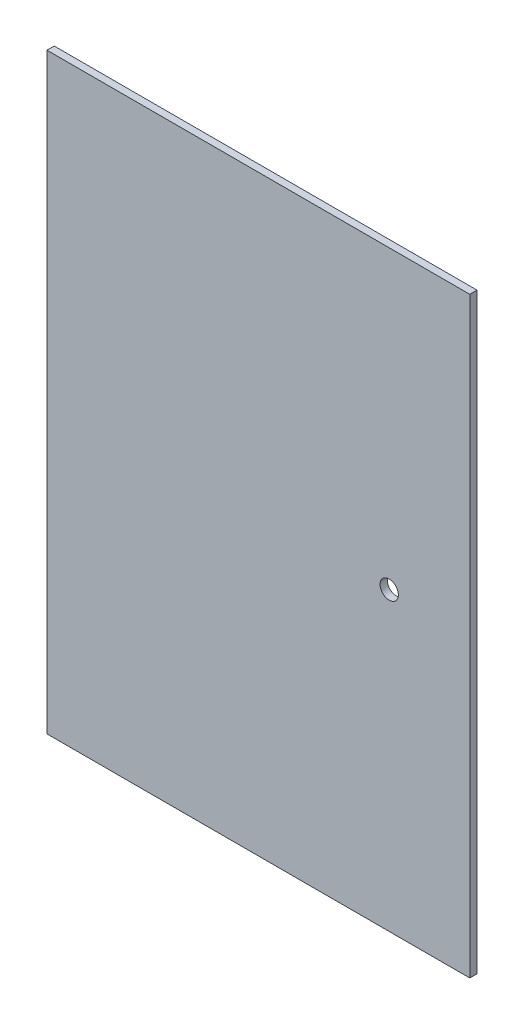
ISO-10303-21;
HEADER;
FILE_DESCRIPTION(('STEP AP214'),'2;1');
FILE_NAME('part.step','',(''),(''),'','','');
FILE_SCHEMA(('AUTOMOTIVE_DESIGN { 1 0 10303 214 1 1 1 1 }'));
ENDSEC;
DATA;
#1=APPLICATION_CONTEXT('core data for automotive mechanical design processes');
#2=APPLICATION_PROTOCOL_DEFINITION('international standard','automotive_design',2000,#1);
#3=PRODUCT_CONTEXT('',#1,'mechanical');
#4=PRODUCT('Part','Part','',(#3));
#5=PRODUCT_RELATED_PRODUCT_CATEGORY('part','',(#4));
#6=PRODUCT_DEFINITION_FORMATION('','',#4);
#7=PRODUCT_DEFINITION_CONTEXT('part definition',#1,'design');
#8=PRODUCT_DEFINITION('design','',#6,#7);
#9=PRODUCT_DEFINITION_SHAPE('','',#8);
#10=(LENGTH_UNIT() NAMED_UNIT(*) SI_UNIT(.MILLI.,.METRE.));
#11=(NAMED_UNIT(*) PLANE_ANGLE_UNIT() SI_UNIT($,.RADIAN.));
#12=(NAMED_UNIT(*) SI_UNIT($,.STERADIAN.) SOLID_ANGLE_UNIT());
#13=UNCERTAINTY_MEASURE_WITH_UNIT(LENGTH_MEASURE(1.E-05),#10,'distance_accuracy_value','');
#14=(GEOMETRIC_REPRESENTATION_CONTEXT(3) GLOBAL_UNCERTAINTY_ASSIGNED_CONTEXT((#13)) GLOBAL_UNIT_ASSIGNED_CONTEXT((#10,
#11,#12)) REPRESENTATION_CONTEXT('',''));
#15=CARTESIAN_POINT('',(0.,0.,0.));
#16=DIRECTION('',(0.,0.,1.));
#17=DIRECTION('',(1.,0.,0.));
#18=AXIS2_PLACEMENT_3D('',#15,#16,#17);
#19=CARTESIAN_POINT('',(-233.5,327.,0.));
#20=DIRECTION('',(-1.,0.,0.));
#21=DIRECTION('',(0.,0.,1.));
#22=AXIS2_PLACEMENT_3D('',#19,#20,#21);
#23=PLANE('',#22);
#24=DIRECTION('',(0.,-1.,0.));
#25=VECTOR('',#24,1.);
#26=CARTESIAN_POINT('',(-233.5,327.,8.));
#27=LINE('',#26,#25);
#28=CARTESIAN_POINT('',(-233.5,327.,8.));
#29=VERTEX_POINT('',#28);
#30=CARTESIAN_POINT('',(-233.5,-327.,8.));
#31=VERTEX_POINT('',#30);
#32=EDGE_CURVE('E100',#29,#31,#27,.T.);
#33=ORIENTED_EDGE('',*,*,#32,.F.);
#34=DIRECTION('',(0.,0.,1.));
#35=VECTOR('',#34,1.);
#36=CARTESIAN_POINT('',(-233.5,327.,0.));
#37=LINE('',#36,#35);
#38=CARTESIAN_POINT('',(-233.5,327.,0.));
#39=VERTEX_POINT('',#38);
#40=EDGE_CURVE('E11',#39,#29,#37,.T.);
#41=ORIENTED_EDGE('',*,*,#40,.F.);
#42=DIRECTION('',(0.,-1.,0.));
#43=VECTOR('',#42,1.);
#44=CARTESIAN_POINT('',(-233.5,327.,0.));
#45=LINE('',#44,#43);
#46=CARTESIAN_POINT('',(-233.5,-327.,0.));
#47=VERTEX_POINT('',#46);
#48=EDGE_CURVE('E93',#39,#47,#45,.T.);
#49=ORIENTED_EDGE('',*,*,#48,.T.);
#50=DIRECTION('',(0.,0.,1.));
#51=VECTOR('',#50,1.);
#52=CARTESIAN_POINT('',(-233.5,-327.,0.));
#53=LINE('',#52,#51);
#54=EDGE_CURVE('E38',#47,#31,#53,.T.);
#55=ORIENTED_EDGE('',*,*,#54,.T.);
#56=EDGE_LOOP('',(#33,#41,#49,#55));
#57=FACE_BOUND('',#56,.T.);
#58=ADVANCED_FACE('F35',(#57),#23,.T.);
#59=CARTESIAN_POINT('',(233.5,327.,0.));
#60=DIRECTION('',(0.,1.,0.));
#61=DIRECTION('',(0.,0.,1.));
#62=AXIS2_PLACEMENT_3D('',#59,#60,#61);
#63=PLANE('',#62);
#64=DIRECTION('',(-1.,0.,0.));
#65=VECTOR('',#64,1.);
#66=CARTESIAN_POINT('',(233.5,327.,8.));
#67=LINE('',#66,#65);
#68=CARTESIAN_POINT('',(233.5,327.,8.));
#69=VERTEX_POINT('',#68);
#70=EDGE_CURVE('E95',#69,#29,#67,.T.);
#71=ORIENTED_EDGE('',*,*,#70,.F.);
#72=DIRECTION('',(0.,0.,1.));
#73=VECTOR('',#72,1.);
#74=CARTESIAN_POINT('',(233.5,327.,0.));
#75=LINE('',#74,#73);
#76=CARTESIAN_POINT('',(233.5,327.,0.));
#77=VERTEX_POINT('',#76);
#78=EDGE_CURVE('E44',#77,#69,#75,.T.);
#79=ORIENTED_EDGE('',*,*,#78,.F.);
#80=DIRECTION('',(-1.,0.,0.));
#81=VECTOR('',#80,1.);
#82=CARTESIAN_POINT('',(233.5,327.,0.));
#83=LINE('',#82,#81);
#84=EDGE_CURVE('E90',#77,#39,#83,.T.);
#85=ORIENTED_EDGE('',*,*,#84,.T.);
#86=ORIENTED_EDGE('',*,*,#40,.T.);
#87=EDGE_LOOP('',(#71,#79,#85,#86));
#88=FACE_BOUND('',#87,.T.);
#89=ADVANCED_FACE('F111',(#88),#63,.T.);
#90=CARTESIAN_POINT('',(233.5,-327.,0.));
#91=DIRECTION('',(1.,0.,0.));
#92=DIRECTION('',(0.,0.,-1.));
#93=AXIS2_PLACEMENT_3D('',#90,#91,#92);
#94=PLANE('',#93);
#95=DIRECTION('',(0.,1.,0.));
#96=VECTOR('',#95,1.);
#97=CARTESIAN_POINT('',(233.5,-327.,8.));
#98=LINE('',#97,#96);
#99=CARTESIAN_POINT('',(233.5,-327.,8.));
#100=VERTEX_POINT('',#99);
#101=EDGE_CURVE('E85',#100,#69,#98,.T.);
#102=ORIENTED_EDGE('',*,*,#101,.F.);
#103=DIRECTION('',(0.,0.,1.));
#104=VECTOR('',#103,1.);
#105=CARTESIAN_POINT('',(233.5,-327.,0.));
#106=LINE('',#105,#104);
#107=CARTESIAN_POINT('',(233.5,-327.,0.));
#108=VERTEX_POINT('',#107);
#109=EDGE_CURVE('E80',#108,#100,#106,.T.);
#110=ORIENTED_EDGE('',*,*,#109,.F.);
#111=DIRECTION('',(0.,1.,0.));
#112=VECTOR('',#111,1.);
#113=CARTESIAN_POINT('',(233.5,-327.,0.));
#114=LINE('',#113,#112);
#115=EDGE_CURVE('E83',#108,#77,#114,.T.);
#116=ORIENTED_EDGE('',*,*,#115,.T.);
#117=ORIENTED_EDGE('',*,*,#78,.T.);
#118=EDGE_LOOP('',(#102,#110,#116,#117));
#119=FACE_BOUND('',#118,.T.);
#120=ADVANCED_FACE('F82',(#119),#94,.T.);
#121=CARTESIAN_POINT('',(-233.5,-327.,0.));
#122=DIRECTION('',(0.,-1.,0.));
#123=DIRECTION('',(0.,0.,-1.));
#124=AXIS2_PLACEMENT_3D('',#121,#122,#123);
#125=PLANE('',#124);
#126=DIRECTION('',(1.,0.,0.));
#127=VECTOR('',#126,1.);
#128=CARTESIAN_POINT('',(-233.5,-327.,8.));
#129=LINE('',#128,#127);
#130=EDGE_CURVE('E103',#31,#100,#129,.T.);
#131=ORIENTED_EDGE('',*,*,#130,.F.);
#132=ORIENTED_EDGE('',*,*,#54,.F.);
#133=DIRECTION('',(1.,0.,0.));
#134=VECTOR('',#133,1.);
#135=CARTESIAN_POINT('',(-233.5,-327.,0.));
#136=LINE('',#135,#134);
#137=EDGE_CURVE('E89',#47,#108,#136,.T.);
#138=ORIENTED_EDGE('',*,*,#137,.T.);
#139=ORIENTED_EDGE('',*,*,#109,.T.);
#140=EDGE_LOOP('',(#131,#132,#138,#139));
#141=FACE_BOUND('',#140,.T.);
#142=ADVANCED_FACE('F92',(#141),#125,.T.);
#143=CARTESIAN_POINT('',(0.,0.,0.));
#144=DIRECTION('',(0.,0.,1.));
#145=DIRECTION('',(1.,0.,0.));
#146=AXIS2_PLACEMENT_3D('',#143,#144,#145);
#147=PLANE('',#146);
#148=CARTESIAN_POINT('',(144.5,0.,0.));
#149=DIRECTION('',(0.,0.,1.));
#150=DIRECTION('',(-1.,0.,0.));
#151=AXIS2_PLACEMENT_3D('',#148,#149,#150);
#152=CIRCLE('',#151,10.1);
#153=CARTESIAN_POINT('',(134.4,0.,0.));
#154=VERTEX_POINT('',#153);
#155=EDGE_CURVE('E104',#154,#154,#152,.T.);
#156=ORIENTED_EDGE('',*,*,#155,.T.);
#157=EDGE_LOOP('',(#156));
#158=FACE_BOUND('',#157,.T.);
#159=ORIENTED_EDGE('',*,*,#48,.F.);
#160=ORIENTED_EDGE('',*,*,#84,.F.);
#161=ORIENTED_EDGE('',*,*,#115,.F.);
#162=ORIENTED_EDGE('',*,*,#137,.F.);
#163=EDGE_LOOP('',(#159,#160,#161,#162));
#164=FACE_BOUND('',#163,.T.);
#165=ADVANCED_FACE('F88',(#158,#164),#147,.F.);
#166=CARTESIAN_POINT('',(0.,0.,8.));
#167=DIRECTION('',(0.,0.,1.));
#168=DIRECTION('',(1.,0.,0.));
#169=AXIS2_PLACEMENT_3D('',#166,#167,#168);
#170=PLANE('',#169);
#171=CARTESIAN_POINT('',(144.5,0.,8.));
#172=DIRECTION('',(0.,0.,1.));
#173=DIRECTION('',(-1.,0.,0.));
#174=AXIS2_PLACEMENT_3D('',#171,#172,#173);
#175=CIRCLE('',#174,10.1);
#176=CARTESIAN_POINT('',(134.4,0.,8.));
#177=VERTEX_POINT('',#176);
#178=EDGE_CURVE('E141',#177,#177,#175,.T.);
#179=ORIENTED_EDGE('',*,*,#178,.F.);
#180=EDGE_LOOP('',(#179));
#181=FACE_BOUND('',#180,.T.);
#182=ORIENTED_EDGE('',*,*,#32,.T.);
#183=ORIENTED_EDGE('',*,*,#130,.T.);
#184=ORIENTED_EDGE('',*,*,#101,.T.);
#185=ORIENTED_EDGE('',*,*,#70,.T.);
#186=EDGE_LOOP('',(#182,#183,#184,#185));
#187=FACE_BOUND('',#186,.T.);
#188=ADVANCED_FACE('F110',(#181,#187),#170,.T.);
#189=CARTESIAN_POINT('',(144.5,0.,0.));
#190=DIRECTION('',(0.,0.,1.));
#191=DIRECTION('',(1.,0.,0.));
#192=AXIS2_PLACEMENT_3D('',#189,#190,#191);
#193=CYLINDRICAL_SURFACE('',#192,10.1);
#194=ORIENTED_EDGE('',*,*,#155,.F.);
#195=EDGE_LOOP('',(#194));
#196=FACE_BOUND('',#195,.T.);
#197=ORIENTED_EDGE('',*,*,#178,.T.);
#198=EDGE_LOOP('',(#197));
#199=FACE_BOUND('',#198,.T.);
#200=ADVANCED_FACE('F129',(#196,#199),#193,.F.);
#201=CLOSED_SHELL('',(#58,#89,#120,#142,#165,#188,#200));
#202=MANIFOLD_SOLID_BREP('B2',#201);
#203=ADVANCED_BREP_SHAPE_REPRESENTATION('',(#18,#202),#14);
#204=SHAPE_DEFINITION_REPRESENTATION(#9,#203);
ENDSEC;
END-ISO-10303-21;
